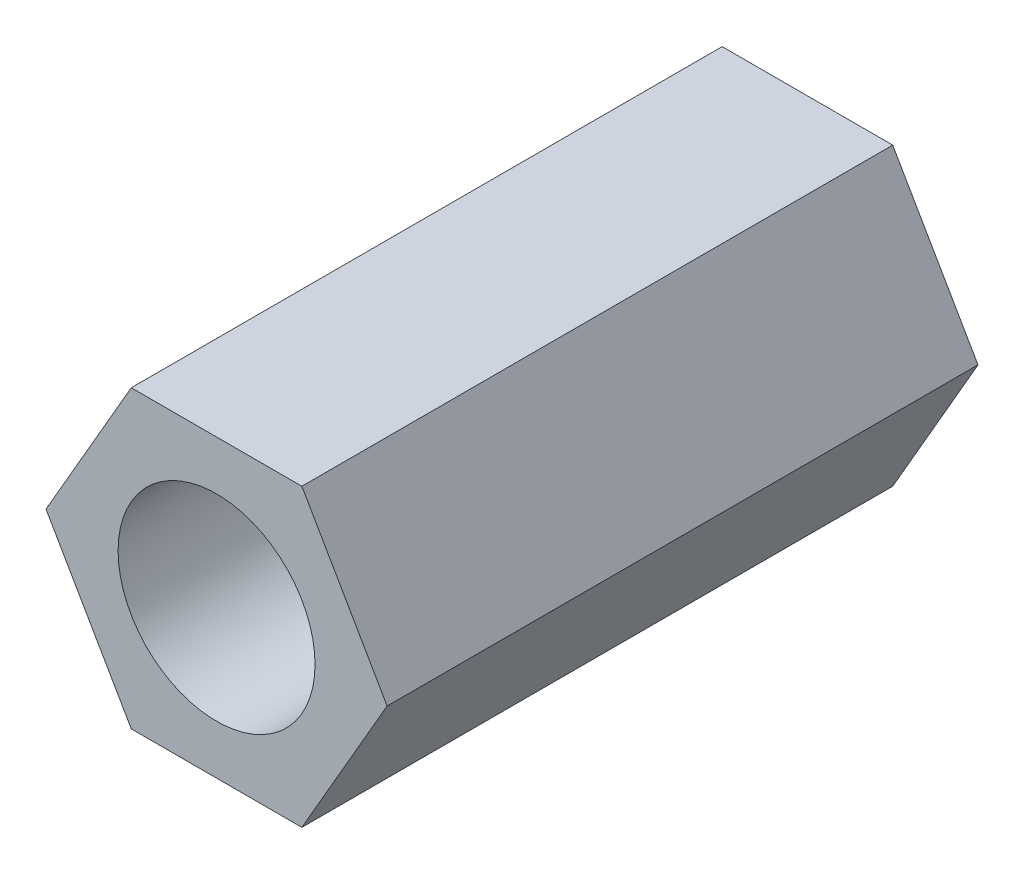
ISO-10303-21;
HEADER;
FILE_DESCRIPTION(('STEP AP214'),'2;1');
FILE_NAME('part.step','',(''),(''),'','','');
FILE_SCHEMA(('AUTOMOTIVE_DESIGN { 1 0 10303 214 1 1 1 1 }'));
ENDSEC;
DATA;
#1=APPLICATION_CONTEXT('core data for automotive mechanical design processes');
#2=APPLICATION_PROTOCOL_DEFINITION('international standard','automotive_design',2000,#1);
#3=PRODUCT_CONTEXT('',#1,'mechanical');
#4=PRODUCT('Part','Part','',(#3));
#5=PRODUCT_RELATED_PRODUCT_CATEGORY('part','',(#4));
#6=PRODUCT_DEFINITION_FORMATION('','',#4);
#7=PRODUCT_DEFINITION_CONTEXT('part definition',#1,'design');
#8=PRODUCT_DEFINITION('design','',#6,#7);
#9=PRODUCT_DEFINITION_SHAPE('','',#8);
#10=(LENGTH_UNIT() NAMED_UNIT(*) SI_UNIT(.MILLI.,.METRE.));
#11=(NAMED_UNIT(*) PLANE_ANGLE_UNIT() SI_UNIT($,.RADIAN.));
#12=(NAMED_UNIT(*) SI_UNIT($,.STERADIAN.) SOLID_ANGLE_UNIT());
#13=UNCERTAINTY_MEASURE_WITH_UNIT(LENGTH_MEASURE(1.E-05),#10,'distance_accuracy_value','');
#14=(GEOMETRIC_REPRESENTATION_CONTEXT(3) GLOBAL_UNCERTAINTY_ASSIGNED_CONTEXT((#13)) GLOBAL_UNIT_ASSIGNED_CONTEXT((#10,
#11,#12)) REPRESENTATION_CONTEXT('',''));
#15=CARTESIAN_POINT('',(0.,0.,0.));
#16=DIRECTION('',(0.,0.,1.));
#17=DIRECTION('',(1.,0.,0.));
#18=AXIS2_PLACEMENT_3D('',#15,#16,#17);
#19=CARTESIAN_POINT('',(0.,0.,6.));
#20=DIRECTION('',(0.,0.,1.));
#21=DIRECTION('',(1.,0.,0.));
#22=AXIS2_PLACEMENT_3D('',#19,#20,#21);
#23=PLANE('',#22);
#24=DIRECTION('',(0.5,0.866025403784438,0.));
#25=VECTOR('',#24,1.);
#26=CARTESIAN_POINT('',(0.86602540378444,-1.5,6.));
#27=LINE('',#26,#25);
#28=CARTESIAN_POINT('',(0.86602540378444,-1.5,6.));
#29=VERTEX_POINT('',#28);
#30=CARTESIAN_POINT('',(1.73205080756888,0.,6.));
#31=VERTEX_POINT('',#30);
#32=EDGE_CURVE('E146',#29,#31,#27,.T.);
#33=ORIENTED_EDGE('',*,*,#32,.T.);
#34=DIRECTION('',(-0.5,0.866025403784438,0.));
#35=VECTOR('',#34,1.);
#36=CARTESIAN_POINT('',(1.73205080756888,0.,6.));
#37=LINE('',#36,#35);
#38=CARTESIAN_POINT('',(0.866025403784438,1.5,6.));
#39=VERTEX_POINT('',#38);
#40=EDGE_CURVE('E94',#31,#39,#37,.T.);
#41=ORIENTED_EDGE('',*,*,#40,.T.);
#42=DIRECTION('',(-1.,0.,0.));
#43=VECTOR('',#42,1.);
#44=CARTESIAN_POINT('',(0.866025403784438,1.5,6.));
#45=LINE('',#44,#43);
#46=CARTESIAN_POINT('',(-0.866025403784439,1.5,6.));
#47=VERTEX_POINT('',#46);
#48=EDGE_CURVE('E107',#39,#47,#45,.T.);
#49=ORIENTED_EDGE('',*,*,#48,.T.);
#50=DIRECTION('',(-0.5,-0.866025403784438,0.));
#51=VECTOR('',#50,1.);
#52=CARTESIAN_POINT('',(-0.866025403784439,1.5,6.));
#53=LINE('',#52,#51);
#54=CARTESIAN_POINT('',(-1.73205080756888,0.,6.));
#55=VERTEX_POINT('',#54);
#56=EDGE_CURVE('E101',#47,#55,#53,.T.);
#57=ORIENTED_EDGE('',*,*,#56,.T.);
#58=DIRECTION('',(0.5,-0.866025403784438,0.));
#59=VECTOR('',#58,1.);
#60=CARTESIAN_POINT('',(-1.73205080756888,0.,6.));
#61=LINE('',#60,#59);
#62=CARTESIAN_POINT('',(-0.866025403784439,-1.5,6.));
#63=VERTEX_POINT('',#62);
#64=EDGE_CURVE('E105',#55,#63,#61,.T.);
#65=ORIENTED_EDGE('',*,*,#64,.T.);
#66=DIRECTION('',(1.,0.,0.));
#67=VECTOR('',#66,1.);
#68=CARTESIAN_POINT('',(-0.866025403784439,-1.5,6.));
#69=LINE('',#68,#67);
#70=EDGE_CURVE('E57',#63,#29,#69,.T.);
#71=ORIENTED_EDGE('',*,*,#70,.T.);
#72=EDGE_LOOP('',(#33,#41,#49,#57,#65,#71));
#73=FACE_BOUND('',#72,.T.);
#74=CARTESIAN_POINT('',(0.,0.,6.));
#75=DIRECTION('',(0.,0.,1.));
#76=DIRECTION('',(1.,0.,0.));
#77=AXIS2_PLACEMENT_3D('',#74,#75,#76);
#78=CIRCLE('',#77,1.);
#79=CARTESIAN_POINT('',(1.,0.,6.));
#80=VERTEX_POINT('',#79);
#81=EDGE_CURVE('E134',#80,#80,#78,.T.);
#82=ORIENTED_EDGE('',*,*,#81,.F.);
#83=EDGE_LOOP('',(#82));
#84=FACE_BOUND('',#83,.T.);
#85=ADVANCED_FACE('F39',(#73,#84),#23,.T.);
#86=CARTESIAN_POINT('',(0.,0.,0.));
#87=DIRECTION('',(0.,0.,1.));
#88=DIRECTION('',(1.,0.,0.));
#89=AXIS2_PLACEMENT_3D('',#86,#87,#88);
#90=PLANE('',#89);
#91=DIRECTION('',(0.5,0.866025403784438,0.));
#92=VECTOR('',#91,1.);
#93=CARTESIAN_POINT('',(0.86602540378444,-1.5,0.));
#94=LINE('',#93,#92);
#95=CARTESIAN_POINT('',(0.86602540378444,-1.5,0.));
#96=VERTEX_POINT('',#95);
#97=CARTESIAN_POINT('',(1.73205080756888,0.,0.));
#98=VERTEX_POINT('',#97);
#99=EDGE_CURVE('E129',#96,#98,#94,.T.);
#100=ORIENTED_EDGE('',*,*,#99,.F.);
#101=DIRECTION('',(1.,0.,0.));
#102=VECTOR('',#101,1.);
#103=CARTESIAN_POINT('',(-0.866025403784439,-1.5,0.));
#104=LINE('',#103,#102);
#105=CARTESIAN_POINT('',(-0.866025403784439,-1.5,0.));
#106=VERTEX_POINT('',#105);
#107=EDGE_CURVE('E86',#106,#96,#104,.T.);
#108=ORIENTED_EDGE('',*,*,#107,.F.);
#109=DIRECTION('',(0.5,-0.866025403784438,0.));
#110=VECTOR('',#109,1.);
#111=CARTESIAN_POINT('',(-1.73205080756888,0.,0.));
#112=LINE('',#111,#110);
#113=CARTESIAN_POINT('',(-1.73205080756888,0.,0.));
#114=VERTEX_POINT('',#113);
#115=EDGE_CURVE('E80',#114,#106,#112,.T.);
#116=ORIENTED_EDGE('',*,*,#115,.F.);
#117=DIRECTION('',(-0.5,-0.866025403784438,0.));
#118=VECTOR('',#117,1.);
#119=CARTESIAN_POINT('',(-0.866025403784439,1.5,0.));
#120=LINE('',#119,#118);
#121=CARTESIAN_POINT('',(-0.866025403784439,1.5,0.));
#122=VERTEX_POINT('',#121);
#123=EDGE_CURVE('E116',#122,#114,#120,.T.);
#124=ORIENTED_EDGE('',*,*,#123,.F.);
#125=DIRECTION('',(-1.,0.,0.));
#126=VECTOR('',#125,1.);
#127=CARTESIAN_POINT('',(0.866025403784438,1.5,0.));
#128=LINE('',#127,#126);
#129=CARTESIAN_POINT('',(0.866025403784438,1.5,0.));
#130=VERTEX_POINT('',#129);
#131=EDGE_CURVE('E137',#130,#122,#128,.T.);
#132=ORIENTED_EDGE('',*,*,#131,.F.);
#133=DIRECTION('',(-0.5,0.866025403784438,0.));
#134=VECTOR('',#133,1.);
#135=CARTESIAN_POINT('',(1.73205080756888,0.,0.));
#136=LINE('',#135,#134);
#137=EDGE_CURVE('E133',#98,#130,#136,.T.);
#138=ORIENTED_EDGE('',*,*,#137,.F.);
#139=EDGE_LOOP('',(#100,#108,#116,#124,#132,#138));
#140=FACE_BOUND('',#139,.T.);
#141=CARTESIAN_POINT('',(0.,0.,0.));
#142=DIRECTION('',(0.,0.,1.));
#143=DIRECTION('',(1.,0.,0.));
#144=AXIS2_PLACEMENT_3D('',#141,#142,#143);
#145=CIRCLE('',#144,1.);
#146=CARTESIAN_POINT('',(1.,0.,0.));
#147=VERTEX_POINT('',#146);
#148=EDGE_CURVE('E243',#147,#147,#145,.T.);
#149=ORIENTED_EDGE('',*,*,#148,.T.);
#150=EDGE_LOOP('',(#149));
#151=FACE_BOUND('',#150,.T.);
#152=ADVANCED_FACE('F159',(#140,#151),#90,.F.);
#153=CARTESIAN_POINT('',(0.86602540378444,-1.5,6.));
#154=DIRECTION('',(-0.866025403784439,0.5,0.));
#155=DIRECTION('',(-0.5,-0.866025403784439,0.));
#156=AXIS2_PLACEMENT_3D('',#153,#154,#155);
#157=PLANE('',#156);
#158=ORIENTED_EDGE('',*,*,#99,.T.);
#159=DIRECTION('',(0.,0.,-1.));
#160=VECTOR('',#159,1.);
#161=CARTESIAN_POINT('',(1.73205080756888,0.,6.));
#162=LINE('',#161,#160);
#163=EDGE_CURVE('E11',#31,#98,#162,.T.);
#164=ORIENTED_EDGE('',*,*,#163,.F.);
#165=ORIENTED_EDGE('',*,*,#32,.F.);
#166=DIRECTION('',(0.,0.,-1.));
#167=VECTOR('',#166,1.);
#168=CARTESIAN_POINT('',(0.86602540378444,-1.5,6.));
#169=LINE('',#168,#167);
#170=EDGE_CURVE('E125',#29,#96,#169,.T.);
#171=ORIENTED_EDGE('',*,*,#170,.T.);
#172=EDGE_LOOP('',(#158,#164,#165,#171));
#173=FACE_BOUND('',#172,.T.);
#174=ADVANCED_FACE('F41',(#173),#157,.F.);
#175=CARTESIAN_POINT('',(1.73205080756888,0.,6.));
#176=DIRECTION('',(-0.866025403784438,-0.5,0.));
#177=DIRECTION('',(0.5,-0.866025403784439,0.));
#178=AXIS2_PLACEMENT_3D('',#175,#176,#177);
#179=PLANE('',#178);
#180=ORIENTED_EDGE('',*,*,#137,.T.);
#181=DIRECTION('',(0.,0.,-1.));
#182=VECTOR('',#181,1.);
#183=CARTESIAN_POINT('',(0.866025403784438,1.5,6.));
#184=LINE('',#183,#182);
#185=EDGE_CURVE('E49',#39,#130,#184,.T.);
#186=ORIENTED_EDGE('',*,*,#185,.F.);
#187=ORIENTED_EDGE('',*,*,#40,.F.);
#188=ORIENTED_EDGE('',*,*,#163,.T.);
#189=EDGE_LOOP('',(#180,#186,#187,#188));
#190=FACE_BOUND('',#189,.T.);
#191=ADVANCED_FACE('F184',(#190),#179,.F.);
#192=CARTESIAN_POINT('',(0.866025403784438,1.5,6.));
#193=DIRECTION('',(0.,-1.,0.));
#194=DIRECTION('',(1.,0.,0.));
#195=AXIS2_PLACEMENT_3D('',#192,#193,#194);
#196=PLANE('',#195);
#197=ORIENTED_EDGE('',*,*,#131,.T.);
#198=DIRECTION('',(0.,0.,-1.));
#199=VECTOR('',#198,1.);
#200=CARTESIAN_POINT('',(-0.866025403784439,1.5,6.));
#201=LINE('',#200,#199);
#202=EDGE_CURVE('E118',#47,#122,#201,.T.);
#203=ORIENTED_EDGE('',*,*,#202,.F.);
#204=ORIENTED_EDGE('',*,*,#48,.F.);
#205=ORIENTED_EDGE('',*,*,#185,.T.);
#206=EDGE_LOOP('',(#197,#203,#204,#205));
#207=FACE_BOUND('',#206,.T.);
#208=ADVANCED_FACE('F156',(#207),#196,.F.);
#209=CARTESIAN_POINT('',(-0.866025403784439,1.5,6.));
#210=DIRECTION('',(0.866025403784439,-0.5,0.));
#211=DIRECTION('',(0.5,0.866025403784439,0.));
#212=AXIS2_PLACEMENT_3D('',#209,#210,#211);
#213=PLANE('',#212);
#214=ORIENTED_EDGE('',*,*,#123,.T.);
#215=DIRECTION('',(0.,0.,-1.));
#216=VECTOR('',#215,1.);
#217=CARTESIAN_POINT('',(-1.73205080756888,0.,6.));
#218=LINE('',#217,#216);
#219=EDGE_CURVE('E113',#55,#114,#218,.T.);
#220=ORIENTED_EDGE('',*,*,#219,.F.);
#221=ORIENTED_EDGE('',*,*,#56,.F.);
#222=ORIENTED_EDGE('',*,*,#202,.T.);
#223=EDGE_LOOP('',(#214,#220,#221,#222));
#224=FACE_BOUND('',#223,.T.);
#225=ADVANCED_FACE('F114',(#224),#213,.F.);
#226=CARTESIAN_POINT('',(-1.73205080756888,0.,6.));
#227=DIRECTION('',(0.866025403784438,0.5,0.));
#228=DIRECTION('',(-0.5,0.866025403784438,0.));
#229=AXIS2_PLACEMENT_3D('',#226,#227,#228);
#230=PLANE('',#229);
#231=ORIENTED_EDGE('',*,*,#115,.T.);
#232=DIRECTION('',(0.,0.,-1.));
#233=VECTOR('',#232,1.);
#234=CARTESIAN_POINT('',(-0.866025403784439,-1.5,6.));
#235=LINE('',#234,#233);
#236=EDGE_CURVE('E119',#63,#106,#235,.T.);
#237=ORIENTED_EDGE('',*,*,#236,.F.);
#238=ORIENTED_EDGE('',*,*,#64,.F.);
#239=ORIENTED_EDGE('',*,*,#219,.T.);
#240=EDGE_LOOP('',(#231,#237,#238,#239));
#241=FACE_BOUND('',#240,.T.);
#242=ADVANCED_FACE('F121',(#241),#230,.F.);
#243=CARTESIAN_POINT('',(-0.866025403784439,-1.5,6.));
#244=DIRECTION('',(0.,1.,0.));
#245=DIRECTION('',(-1.,0.,0.));
#246=AXIS2_PLACEMENT_3D('',#243,#244,#245);
#247=PLANE('',#246);
#248=ORIENTED_EDGE('',*,*,#107,.T.);
#249=ORIENTED_EDGE('',*,*,#170,.F.);
#250=ORIENTED_EDGE('',*,*,#70,.F.);
#251=ORIENTED_EDGE('',*,*,#236,.T.);
#252=EDGE_LOOP('',(#248,#249,#250,#251));
#253=FACE_BOUND('',#252,.T.);
#254=ADVANCED_FACE('F164',(#253),#247,.F.);
#255=CARTESIAN_POINT('',(0.,0.,6.));
#256=DIRECTION('',(0.,0.,-1.));
#257=DIRECTION('',(-1.,0.,0.));
#258=AXIS2_PLACEMENT_3D('',#255,#256,#257);
#259=CYLINDRICAL_SURFACE('',#258,1.);
#260=ORIENTED_EDGE('',*,*,#81,.T.);
#261=EDGE_LOOP('',(#260));
#262=FACE_BOUND('',#261,.T.);
#263=ORIENTED_EDGE('',*,*,#148,.F.);
#264=EDGE_LOOP('',(#263));
#265=FACE_BOUND('',#264,.T.);
#266=ADVANCED_FACE('F166',(#262,#265),#259,.F.);
#267=CLOSED_SHELL('',(#85,#152,#174,#191,#208,#225,#242,#254,#266));
#268=MANIFOLD_SOLID_BREP('B2',#267);
#269=ADVANCED_BREP_SHAPE_REPRESENTATION('',(#18,#268),#14);
#270=SHAPE_DEFINITION_REPRESENTATION(#9,#269);
ENDSEC;
END-ISO-10303-21;
